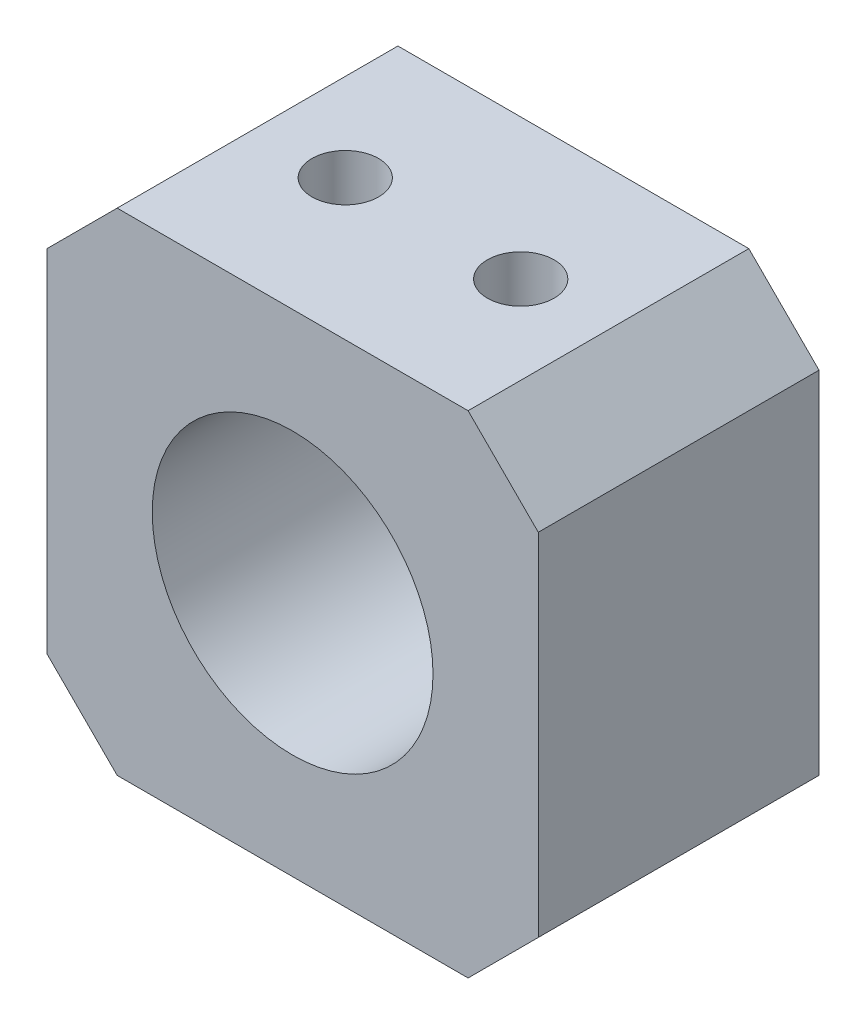
ISO-10303-21;
HEADER;
FILE_DESCRIPTION(('STEP AP214'),'2;1');
FILE_NAME('part.step','',(''),(''),'','','');
FILE_SCHEMA(('AUTOMOTIVE_DESIGN { 1 0 10303 214 1 1 1 1 }'));
ENDSEC;
DATA;
#1=APPLICATION_CONTEXT('core data for automotive mechanical design processes');
#2=APPLICATION_PROTOCOL_DEFINITION('international standard','automotive_design',2000,#1);
#3=PRODUCT_CONTEXT('',#1,'mechanical');
#4=PRODUCT('Part','Part','',(#3));
#5=PRODUCT_RELATED_PRODUCT_CATEGORY('part','',(#4));
#6=PRODUCT_DEFINITION_FORMATION('','',#4);
#7=PRODUCT_DEFINITION_CONTEXT('part definition',#1,'design');
#8=PRODUCT_DEFINITION('design','',#6,#7);
#9=PRODUCT_DEFINITION_SHAPE('','',#8);
#10=(LENGTH_UNIT() NAMED_UNIT(*) SI_UNIT(.MILLI.,.METRE.));
#11=(NAMED_UNIT(*) PLANE_ANGLE_UNIT() SI_UNIT($,.RADIAN.));
#12=(NAMED_UNIT(*) SI_UNIT($,.STERADIAN.) SOLID_ANGLE_UNIT());
#13=UNCERTAINTY_MEASURE_WITH_UNIT(LENGTH_MEASURE(1.E-05),#10,'distance_accuracy_value','');
#14=(GEOMETRIC_REPRESENTATION_CONTEXT(3) GLOBAL_UNCERTAINTY_ASSIGNED_CONTEXT((#13)) GLOBAL_UNIT_ASSIGNED_CONTEXT((#10,
#11,#12)) REPRESENTATION_CONTEXT('',''));
#15=CARTESIAN_POINT('',(0.,0.,0.));
#16=DIRECTION('',(0.,0.,1.));
#17=DIRECTION('',(1.,0.,0.));
#18=AXIS2_PLACEMENT_3D('',#15,#16,#17);
#19=CARTESIAN_POINT('',(0.,0.,4.));
#20=DIRECTION('',(0.,0.,1.));
#21=DIRECTION('',(1.,0.,0.));
#22=AXIS2_PLACEMENT_3D('',#19,#20,#21);
#23=PLANE('',#22);
#24=DIRECTION('',(1.,0.,0.));
#25=VECTOR('',#24,1.);
#26=CARTESIAN_POINT('',(3.5,-3.5,4.));
#27=LINE('',#26,#25);
#28=CARTESIAN_POINT('',(-2.5,-3.5,4.));
#29=VERTEX_POINT('',#28);
#30=CARTESIAN_POINT('',(2.5,-3.5,4.));
#31=VERTEX_POINT('',#30);
#32=EDGE_CURVE('E155',#29,#31,#27,.T.);
#33=ORIENTED_EDGE('',*,*,#32,.T.);
#34=DIRECTION('',(-0.707106781186549,-0.707106781186546,0.));
#35=VECTOR('',#34,1.);
#36=CARTESIAN_POINT('',(2.99999999999999,-3.,4.));
#37=LINE('',#36,#35);
#38=CARTESIAN_POINT('',(3.5,-2.5,4.));
#39=VERTEX_POINT('',#38);
#40=EDGE_CURVE('E213',#31,#39,#37,.F.);
#41=ORIENTED_EDGE('',*,*,#40,.T.);
#42=DIRECTION('',(0.,1.,0.));
#43=VECTOR('',#42,1.);
#44=CARTESIAN_POINT('',(3.5,-3.5,4.));
#45=LINE('',#44,#43);
#46=CARTESIAN_POINT('',(3.5,2.5,4.));
#47=VERTEX_POINT('',#46);
#48=EDGE_CURVE('E160',#39,#47,#45,.T.);
#49=ORIENTED_EDGE('',*,*,#48,.T.);
#50=DIRECTION('',(0.707106781186546,-0.707106781186549,0.));
#51=VECTOR('',#50,1.);
#52=CARTESIAN_POINT('',(3.00000000000001,3.,4.));
#53=LINE('',#52,#51);
#54=CARTESIAN_POINT('',(2.5,3.5,4.));
#55=VERTEX_POINT('',#54);
#56=EDGE_CURVE('E68',#47,#55,#53,.F.);
#57=ORIENTED_EDGE('',*,*,#56,.T.);
#58=DIRECTION('',(-1.,0.,0.));
#59=VECTOR('',#58,1.);
#60=CARTESIAN_POINT('',(3.5,3.5,4.));
#61=LINE('',#60,#59);
#62=CARTESIAN_POINT('',(-2.5,3.5,4.));
#63=VERTEX_POINT('',#62);
#64=EDGE_CURVE('E163',#55,#63,#61,.T.);
#65=ORIENTED_EDGE('',*,*,#64,.T.);
#66=DIRECTION('',(0.707106781186549,0.707106781186546,0.));
#67=VECTOR('',#66,1.);
#68=CARTESIAN_POINT('',(-3.,3.,4.));
#69=LINE('',#68,#67);
#70=CARTESIAN_POINT('',(-3.5,2.5,4.));
#71=VERTEX_POINT('',#70);
#72=EDGE_CURVE('E207',#63,#71,#69,.F.);
#73=ORIENTED_EDGE('',*,*,#72,.T.);
#74=DIRECTION('',(0.,-1.,0.));
#75=VECTOR('',#74,1.);
#76=CARTESIAN_POINT('',(-3.5,-3.5,4.));
#77=LINE('',#76,#75);
#78=CARTESIAN_POINT('',(-3.5,-2.5,4.));
#79=VERTEX_POINT('',#78);
#80=EDGE_CURVE('E151',#71,#79,#77,.T.);
#81=ORIENTED_EDGE('',*,*,#80,.T.);
#82=DIRECTION('',(-0.707106781186546,0.707106781186549,0.));
#83=VECTOR('',#82,1.);
#84=CARTESIAN_POINT('',(-3.,-2.99999999999999,4.));
#85=LINE('',#84,#83);
#86=EDGE_CURVE('E210',#79,#29,#85,.F.);
#87=ORIENTED_EDGE('',*,*,#86,.T.);
#88=EDGE_LOOP('',(#33,#41,#49,#57,#65,#73,#81,#87));
#89=FACE_BOUND('',#88,.T.);
#90=CARTESIAN_POINT('',(0.,0.,4.));
#91=DIRECTION('',(0.,0.,1.));
#92=DIRECTION('',(1.,0.,0.));
#93=AXIS2_PLACEMENT_3D('',#90,#91,#92);
#94=CIRCLE('',#93,2.);
#95=CARTESIAN_POINT('',(2.,0.,4.));
#96=VERTEX_POINT('',#95);
#97=EDGE_CURVE('E143',#96,#96,#94,.T.);
#98=ORIENTED_EDGE('',*,*,#97,.F.);
#99=EDGE_LOOP('',(#98));
#100=FACE_BOUND('',#99,.T.);
#101=ADVANCED_FACE('F46',(#89,#100),#23,.T.);
#102=CARTESIAN_POINT('',(0.,0.,0.));
#103=DIRECTION('',(0.,0.,1.));
#104=DIRECTION('',(1.,0.,0.));
#105=AXIS2_PLACEMENT_3D('',#102,#103,#104);
#106=PLANE('',#105);
#107=DIRECTION('',(0.,1.,0.));
#108=VECTOR('',#107,1.);
#109=CARTESIAN_POINT('',(3.5,-3.5,0.));
#110=LINE('',#109,#108);
#111=CARTESIAN_POINT('',(3.5,-2.5,0.));
#112=VERTEX_POINT('',#111);
#113=CARTESIAN_POINT('',(3.5,2.5,0.));
#114=VERTEX_POINT('',#113);
#115=EDGE_CURVE('E174',#112,#114,#110,.T.);
#116=ORIENTED_EDGE('',*,*,#115,.F.);
#117=DIRECTION('',(0.707106781186549,0.707106781186546,0.));
#118=VECTOR('',#117,1.);
#119=CARTESIAN_POINT('',(3.5,-2.5,0.));
#120=LINE('',#119,#118);
#121=CARTESIAN_POINT('',(2.5,-3.5,0.));
#122=VERTEX_POINT('',#121);
#123=EDGE_CURVE('E195',#112,#122,#120,.F.);
#124=ORIENTED_EDGE('',*,*,#123,.T.);
#125=DIRECTION('',(1.,0.,0.));
#126=VECTOR('',#125,1.);
#127=CARTESIAN_POINT('',(3.5,-3.5,0.));
#128=LINE('',#127,#126);
#129=CARTESIAN_POINT('',(-2.5,-3.5,0.));
#130=VERTEX_POINT('',#129);
#131=EDGE_CURVE('E170',#130,#122,#128,.T.);
#132=ORIENTED_EDGE('',*,*,#131,.F.);
#133=DIRECTION('',(0.707106781186546,-0.707106781186549,0.));
#134=VECTOR('',#133,1.);
#135=CARTESIAN_POINT('',(-2.5,-3.5,0.));
#136=LINE('',#135,#134);
#137=CARTESIAN_POINT('',(-3.5,-2.5,0.));
#138=VERTEX_POINT('',#137);
#139=EDGE_CURVE('E192',#130,#138,#136,.F.);
#140=ORIENTED_EDGE('',*,*,#139,.T.);
#141=DIRECTION('',(0.,-1.,0.));
#142=VECTOR('',#141,1.);
#143=CARTESIAN_POINT('',(-3.5,-3.5,0.));
#144=LINE('',#143,#142);
#145=CARTESIAN_POINT('',(-3.5,2.5,0.));
#146=VERTEX_POINT('',#145);
#147=EDGE_CURVE('E147',#146,#138,#144,.T.);
#148=ORIENTED_EDGE('',*,*,#147,.F.);
#149=DIRECTION('',(-0.707106781186549,-0.707106781186546,0.));
#150=VECTOR('',#149,1.);
#151=CARTESIAN_POINT('',(-3.5,2.5,0.));
#152=LINE('',#151,#150);
#153=CARTESIAN_POINT('',(-2.5,3.5,0.));
#154=VERTEX_POINT('',#153);
#155=EDGE_CURVE('E189',#146,#154,#152,.F.);
#156=ORIENTED_EDGE('',*,*,#155,.T.);
#157=DIRECTION('',(-1.,0.,0.));
#158=VECTOR('',#157,1.);
#159=CARTESIAN_POINT('',(3.5,3.5,0.));
#160=LINE('',#159,#158);
#161=CARTESIAN_POINT('',(2.5,3.5,0.));
#162=VERTEX_POINT('',#161);
#163=EDGE_CURVE('E156',#162,#154,#160,.T.);
#164=ORIENTED_EDGE('',*,*,#163,.F.);
#165=DIRECTION('',(-0.707106781186546,0.707106781186549,0.));
#166=VECTOR('',#165,1.);
#167=CARTESIAN_POINT('',(2.5,3.5,0.));
#168=LINE('',#167,#166);
#169=EDGE_CURVE('E186',#162,#114,#168,.F.);
#170=ORIENTED_EDGE('',*,*,#169,.T.);
#171=EDGE_LOOP('',(#116,#124,#132,#140,#148,#156,#164,#170));
#172=FACE_BOUND('',#171,.T.);
#173=CARTESIAN_POINT('',(0.,0.,0.));
#174=DIRECTION('',(0.,0.,1.));
#175=DIRECTION('',(1.,0.,0.));
#176=AXIS2_PLACEMENT_3D('',#173,#174,#175);
#177=CIRCLE('',#176,2.);
#178=CARTESIAN_POINT('',(2.,0.,0.));
#179=VERTEX_POINT('',#178);
#180=EDGE_CURVE('E142',#179,#179,#177,.T.);
#181=ORIENTED_EDGE('',*,*,#180,.T.);
#182=EDGE_LOOP('',(#181));
#183=FACE_BOUND('',#182,.T.);
#184=ADVANCED_FACE('F230',(#172,#183),#106,.F.);
#185=CARTESIAN_POINT('',(-3.5,-3.5,4.));
#186=DIRECTION('',(1.,0.,0.));
#187=DIRECTION('',(0.,0.,-1.));
#188=AXIS2_PLACEMENT_3D('',#185,#186,#187);
#189=PLANE('',#188);
#190=ORIENTED_EDGE('',*,*,#147,.T.);
#191=DIRECTION('',(0.,0.,1.));
#192=VECTOR('',#191,1.);
#193=CARTESIAN_POINT('',(-3.5,-2.5,4.));
#194=LINE('',#193,#192);
#195=EDGE_CURVE('E220',#138,#79,#194,.T.);
#196=ORIENTED_EDGE('',*,*,#195,.T.);
#197=ORIENTED_EDGE('',*,*,#80,.F.);
#198=DIRECTION('',(0.,0.,-1.));
#199=VECTOR('',#198,1.);
#200=CARTESIAN_POINT('',(-3.5,2.5,4.));
#201=LINE('',#200,#199);
#202=EDGE_CURVE('E216',#71,#146,#201,.T.);
#203=ORIENTED_EDGE('',*,*,#202,.T.);
#204=EDGE_LOOP('',(#190,#196,#197,#203));
#205=FACE_BOUND('',#204,.T.);
#206=ADVANCED_FACE('F239',(#205),#189,.F.);
#207=CARTESIAN_POINT('',(3.5,-3.5,4.));
#208=DIRECTION('',(0.,1.,0.));
#209=DIRECTION('',(-1.,0.,0.));
#210=AXIS2_PLACEMENT_3D('',#207,#208,#209);
#211=PLANE('',#210);
#212=ORIENTED_EDGE('',*,*,#131,.T.);
#213=DIRECTION('',(0.,0.,1.));
#214=VECTOR('',#213,1.);
#215=CARTESIAN_POINT('',(2.5,-3.5,4.));
#216=LINE('',#215,#214);
#217=EDGE_CURVE('E202',#122,#31,#216,.T.);
#218=ORIENTED_EDGE('',*,*,#217,.T.);
#219=ORIENTED_EDGE('',*,*,#32,.F.);
#220=DIRECTION('',(0.,0.,-1.));
#221=VECTOR('',#220,1.);
#222=CARTESIAN_POINT('',(-2.5,-3.5,4.));
#223=LINE('',#222,#221);
#224=EDGE_CURVE('E198',#29,#130,#223,.T.);
#225=ORIENTED_EDGE('',*,*,#224,.T.);
#226=EDGE_LOOP('',(#212,#218,#219,#225));
#227=FACE_BOUND('',#226,.T.);
#228=ADVANCED_FACE('F249',(#227),#211,.F.);
#229=CARTESIAN_POINT('',(3.5,-3.5,4.));
#230=DIRECTION('',(-1.,0.,0.));
#231=DIRECTION('',(0.,0.,1.));
#232=AXIS2_PLACEMENT_3D('',#229,#230,#231);
#233=PLANE('',#232);
#234=ORIENTED_EDGE('',*,*,#48,.F.);
#235=DIRECTION('',(0.,0.,-1.));
#236=VECTOR('',#235,1.);
#237=CARTESIAN_POINT('',(3.5,-2.5,4.));
#238=LINE('',#237,#236);
#239=EDGE_CURVE('E182',#39,#112,#238,.T.);
#240=ORIENTED_EDGE('',*,*,#239,.T.);
#241=ORIENTED_EDGE('',*,*,#115,.T.);
#242=DIRECTION('',(0.,0.,1.));
#243=VECTOR('',#242,1.);
#244=CARTESIAN_POINT('',(3.5,2.5,4.));
#245=LINE('',#244,#243);
#246=EDGE_CURVE('E166',#114,#47,#245,.T.);
#247=ORIENTED_EDGE('',*,*,#246,.T.);
#248=EDGE_LOOP('',(#234,#240,#241,#247));
#249=FACE_BOUND('',#248,.T.);
#250=ADVANCED_FACE('F257',(#249),#233,.F.);
#251=CARTESIAN_POINT('',(3.5,3.5,4.));
#252=DIRECTION('',(0.,-1.,0.));
#253=DIRECTION('',(1.,0.,0.));
#254=AXIS2_PLACEMENT_3D('',#251,#252,#253);
#255=PLANE('',#254);
#256=CARTESIAN_POINT('',(-1.25,3.5,2.));
#257=DIRECTION('',(0.,1.,0.));
#258=DIRECTION('',(0.,0.,1.));
#259=AXIS2_PLACEMENT_3D('',#256,#257,#258);
#260=CIRCLE('',#259,0.474999999999989);
#261=CARTESIAN_POINT('',(-1.25,3.5,2.47499999999999));
#262=VERTEX_POINT('',#261);
#263=EDGE_CURVE('E129',#262,#262,#260,.T.);
#264=ORIENTED_EDGE('',*,*,#263,.F.);
#265=EDGE_LOOP('',(#264));
#266=FACE_BOUND('',#265,.T.);
#267=CARTESIAN_POINT('',(1.25,3.5,2.));
#268=DIRECTION('',(0.,1.,0.));
#269=DIRECTION('',(0.,0.,1.));
#270=AXIS2_PLACEMENT_3D('',#267,#268,#269);
#271=CIRCLE('',#270,0.474999999999989);
#272=CARTESIAN_POINT('',(1.25,3.5,2.47499999999999));
#273=VERTEX_POINT('',#272);
#274=EDGE_CURVE('E128',#273,#273,#271,.T.);
#275=ORIENTED_EDGE('',*,*,#274,.F.);
#276=EDGE_LOOP('',(#275));
#277=FACE_BOUND('',#276,.T.);
#278=ORIENTED_EDGE('',*,*,#163,.T.);
#279=DIRECTION('',(0.,0.,1.));
#280=VECTOR('',#279,1.);
#281=CARTESIAN_POINT('',(-2.5,3.5,4.));
#282=LINE('',#281,#280);
#283=EDGE_CURVE('E11',#154,#63,#282,.T.);
#284=ORIENTED_EDGE('',*,*,#283,.T.);
#285=ORIENTED_EDGE('',*,*,#64,.F.);
#286=DIRECTION('',(0.,0.,-1.));
#287=VECTOR('',#286,1.);
#288=CARTESIAN_POINT('',(2.5,3.5,4.));
#289=LINE('',#288,#287);
#290=EDGE_CURVE('E56',#55,#162,#289,.T.);
#291=ORIENTED_EDGE('',*,*,#290,.T.);
#292=EDGE_LOOP('',(#278,#284,#285,#291));
#293=FACE_BOUND('',#292,.T.);
#294=ADVANCED_FACE('F226',(#266,#277,#293),#255,.F.);
#295=CARTESIAN_POINT('',(0.,0.,4.));
#296=DIRECTION('',(0.,0.,-1.));
#297=DIRECTION('',(-1.,0.,0.));
#298=AXIS2_PLACEMENT_3D('',#295,#296,#297);
#299=CYLINDRICAL_SURFACE('',#298,2.);
#300=ORIENTED_EDGE('',*,*,#97,.T.);
#301=EDGE_LOOP('',(#300));
#302=FACE_BOUND('',#301,.T.);
#303=ORIENTED_EDGE('',*,*,#180,.F.);
#304=EDGE_LOOP('',(#303));
#305=FACE_BOUND('',#304,.T.);
#306=ADVANCED_FACE('F274',(#302,#305),#299,.F.);
#307=CARTESIAN_POINT('',(3.5,-2.5,4.));
#308=DIRECTION('',(-0.707106781186546,0.707106781186549,0.));
#309=DIRECTION('',(0.,0.,-1.));
#310=AXIS2_PLACEMENT_3D('',#307,#308,#309);
#311=PLANE('',#310);
#312=ORIENTED_EDGE('',*,*,#40,.F.);
#313=ORIENTED_EDGE('',*,*,#217,.F.);
#314=ORIENTED_EDGE('',*,*,#123,.F.);
#315=ORIENTED_EDGE('',*,*,#239,.F.);
#316=EDGE_LOOP('',(#312,#313,#314,#315));
#317=FACE_BOUND('',#316,.T.);
#318=ADVANCED_FACE('F254',(#317),#311,.F.);
#319=CARTESIAN_POINT('',(-2.5,-3.5,4.));
#320=DIRECTION('',(0.707106781186549,0.707106781186546,0.));
#321=DIRECTION('',(0.,0.,-1.));
#322=AXIS2_PLACEMENT_3D('',#319,#320,#321);
#323=PLANE('',#322);
#324=ORIENTED_EDGE('',*,*,#86,.F.);
#325=ORIENTED_EDGE('',*,*,#195,.F.);
#326=ORIENTED_EDGE('',*,*,#139,.F.);
#327=ORIENTED_EDGE('',*,*,#224,.F.);
#328=EDGE_LOOP('',(#324,#325,#326,#327));
#329=FACE_BOUND('',#328,.T.);
#330=ADVANCED_FACE('F246',(#329),#323,.F.);
#331=CARTESIAN_POINT('',(-3.5,2.5,4.));
#332=DIRECTION('',(0.707106781186546,-0.707106781186548,0.));
#333=DIRECTION('',(0.,0.,-1.));
#334=AXIS2_PLACEMENT_3D('',#331,#332,#333);
#335=PLANE('',#334);
#336=ORIENTED_EDGE('',*,*,#72,.F.);
#337=ORIENTED_EDGE('',*,*,#283,.F.);
#338=ORIENTED_EDGE('',*,*,#155,.F.);
#339=ORIENTED_EDGE('',*,*,#202,.F.);
#340=EDGE_LOOP('',(#336,#337,#338,#339));
#341=FACE_BOUND('',#340,.T.);
#342=ADVANCED_FACE('F236',(#341),#335,.F.);
#343=CARTESIAN_POINT('',(2.5,3.5,4.));
#344=DIRECTION('',(-0.707106781186549,-0.707106781186546,0.));
#345=DIRECTION('',(0.,0.,-1.));
#346=AXIS2_PLACEMENT_3D('',#343,#344,#345);
#347=PLANE('',#346);
#348=ORIENTED_EDGE('',*,*,#56,.F.);
#349=ORIENTED_EDGE('',*,*,#246,.F.);
#350=ORIENTED_EDGE('',*,*,#169,.F.);
#351=ORIENTED_EDGE('',*,*,#290,.F.);
#352=EDGE_LOOP('',(#348,#349,#350,#351));
#353=FACE_BOUND('',#352,.T.);
#354=ADVANCED_FACE('F49',(#353),#347,.F.);
#355=CARTESIAN_POINT('',(1.25,2.3,2.));
#356=DIRECTION('',(0.,1.,0.));
#357=DIRECTION('',(0.,0.,1.));
#358=AXIS2_PLACEMENT_3D('',#355,#356,#357);
#359=CONICAL_SURFACE('',#358,0.475,1.02974425867665);
#360=CARTESIAN_POINT('',(1.25,2.01459120596191,2.));
#361=VERTEX_POINT('',#360);
#362=VERTEX_LOOP('',#361);
#363=FACE_BOUND('',#362,.T.);
#364=CARTESIAN_POINT('',(1.25,2.3,2.));
#365=DIRECTION('',(0.,1.,0.));
#366=DIRECTION('',(0.,0.,1.));
#367=AXIS2_PLACEMENT_3D('',#364,#365,#366);
#368=CIRCLE('',#367,0.475);
#369=CARTESIAN_POINT('',(1.25,2.3,2.475));
#370=VERTEX_POINT('',#369);
#371=EDGE_CURVE('E134',#370,#370,#368,.T.);
#372=ORIENTED_EDGE('',*,*,#371,.T.);
#373=EDGE_LOOP('',(#372));
#374=FACE_BOUND('',#373,.T.);
#375=ADVANCED_FACE('F260',(#363,#374),#359,.F.);
#376=CARTESIAN_POINT('',(1.25,3.5,2.));
#377=DIRECTION('',(0.,1.,0.));
#378=DIRECTION('',(0.,0.,1.));
#379=AXIS2_PLACEMENT_3D('',#376,#377,#378);
#380=CYLINDRICAL_SURFACE('',#379,0.474999999999995);
#381=ORIENTED_EDGE('',*,*,#371,.F.);
#382=EDGE_LOOP('',(#381));
#383=FACE_BOUND('',#382,.T.);
#384=ORIENTED_EDGE('',*,*,#274,.T.);
#385=EDGE_LOOP('',(#384));
#386=FACE_BOUND('',#385,.T.);
#387=ADVANCED_FACE('F121',(#383,#386),#380,.F.);
#388=CARTESIAN_POINT('',(-1.25,2.3,2.));
#389=DIRECTION('',(0.,1.,0.));
#390=DIRECTION('',(0.,0.,1.));
#391=AXIS2_PLACEMENT_3D('',#388,#389,#390);
#392=CONICAL_SURFACE('',#391,0.475,1.02974425867665);
#393=CARTESIAN_POINT('',(-1.25,2.01459120596191,2.));
#394=VERTEX_POINT('',#393);
#395=VERTEX_LOOP('',#394);
#396=FACE_BOUND('',#395,.T.);
#397=CARTESIAN_POINT('',(-1.25,2.3,2.));
#398=DIRECTION('',(0.,1.,0.));
#399=DIRECTION('',(0.,0.,1.));
#400=AXIS2_PLACEMENT_3D('',#397,#398,#399);
#401=CIRCLE('',#400,0.475);
#402=CARTESIAN_POINT('',(-1.25,2.3,2.475));
#403=VERTEX_POINT('',#402);
#404=EDGE_CURVE('E125',#403,#403,#401,.T.);
#405=ORIENTED_EDGE('',*,*,#404,.T.);
#406=EDGE_LOOP('',(#405));
#407=FACE_BOUND('',#406,.T.);
#408=ADVANCED_FACE('F117',(#396,#407),#392,.F.);
#409=CARTESIAN_POINT('',(-1.25,3.5,2.));
#410=DIRECTION('',(0.,1.,0.));
#411=DIRECTION('',(0.,0.,1.));
#412=AXIS2_PLACEMENT_3D('',#409,#410,#411);
#413=CYLINDRICAL_SURFACE('',#412,0.474999999999995);
#414=ORIENTED_EDGE('',*,*,#404,.F.);
#415=EDGE_LOOP('',(#414));
#416=FACE_BOUND('',#415,.T.);
#417=ORIENTED_EDGE('',*,*,#263,.T.);
#418=EDGE_LOOP('',(#417));
#419=FACE_BOUND('',#418,.T.);
#420=ADVANCED_FACE('F120',(#416,#419),#413,.F.);
#421=CLOSED_SHELL('',(#101,#184,#206,#228,#250,#294,#306,#318,#330,#342,#354,#375,#387,#408,#420));
#422=MANIFOLD_SOLID_BREP('B2',#421);
#423=ADVANCED_BREP_SHAPE_REPRESENTATION('',(#18,#422),#14);
#424=SHAPE_DEFINITION_REPRESENTATION(#9,#423);
ENDSEC;
END-ISO-10303-21;
